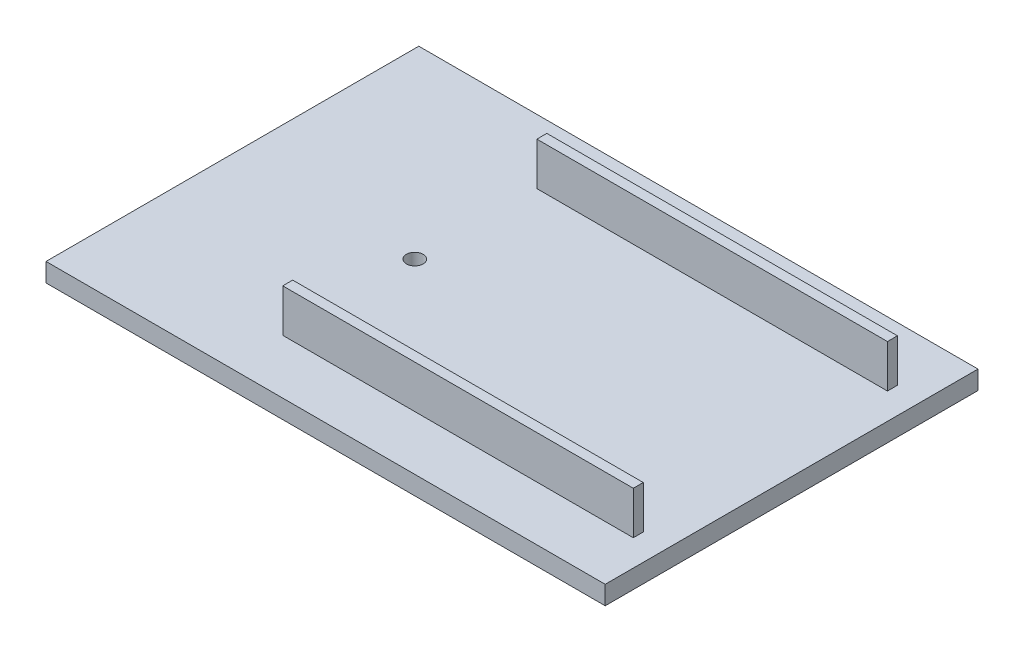
ISO-10303-21;
HEADER;
FILE_DESCRIPTION(('STEP AP214'),'2;1');
FILE_NAME('part.step','',(''),(''),'','','');
FILE_SCHEMA(('AUTOMOTIVE_DESIGN { 1 0 10303 214 1 1 1 1 }'));
ENDSEC;
DATA;
#1=APPLICATION_CONTEXT('core data for automotive mechanical design processes');
#2=APPLICATION_PROTOCOL_DEFINITION('international standard','automotive_design',2000,#1);
#3=PRODUCT_CONTEXT('',#1,'mechanical');
#4=PRODUCT('Part','Part','',(#3));
#5=PRODUCT_RELATED_PRODUCT_CATEGORY('part','',(#4));
#6=PRODUCT_DEFINITION_FORMATION('','',#4);
#7=PRODUCT_DEFINITION_CONTEXT('part definition',#1,'design');
#8=PRODUCT_DEFINITION('design','',#6,#7);
#9=PRODUCT_DEFINITION_SHAPE('','',#8);
#10=(LENGTH_UNIT() NAMED_UNIT(*) SI_UNIT(.MILLI.,.METRE.));
#11=(NAMED_UNIT(*) PLANE_ANGLE_UNIT() SI_UNIT($,.RADIAN.));
#12=(NAMED_UNIT(*) SI_UNIT($,.STERADIAN.) SOLID_ANGLE_UNIT());
#13=UNCERTAINTY_MEASURE_WITH_UNIT(LENGTH_MEASURE(1.E-05),#10,'distance_accuracy_value','');
#14=(GEOMETRIC_REPRESENTATION_CONTEXT(3) GLOBAL_UNCERTAINTY_ASSIGNED_CONTEXT((#13)) GLOBAL_UNIT_ASSIGNED_CONTEXT((#10,
#11,#12)) REPRESENTATION_CONTEXT('',''));
#15=CARTESIAN_POINT('',(0.,0.,0.));
#16=DIRECTION('',(0.,0.,1.));
#17=DIRECTION('',(1.,0.,0.));
#18=AXIS2_PLACEMENT_3D('',#15,#16,#17);
#19=CARTESIAN_POINT('',(0.,10.,0.));
#20=DIRECTION('',(0.,1.,0.));
#21=DIRECTION('',(0.,0.,1.));
#22=AXIS2_PLACEMENT_3D('',#19,#20,#21);
#23=PLANE('',#22);
#24=DIRECTION('',(-1.,0.,0.));
#25=VECTOR('',#24,1.);
#26=CARTESIAN_POINT('',(0.,10.,-65.5));
#27=LINE('',#26,#25);
#28=CARTESIAN_POINT('',(135.922227670832,10.,-65.5));
#29=VERTEX_POINT('',#28);
#30=CARTESIAN_POINT('',(-52.1493552323105,10.,-65.5));
#31=VERTEX_POINT('',#30);
#32=EDGE_CURVE('E212',#29,#31,#27,.T.);
#33=ORIENTED_EDGE('',*,*,#32,.T.);
#34=DIRECTION('',(0.,0.,-1.));
#35=VECTOR('',#34,1.);
#36=CARTESIAN_POINT('',(-52.1493552323105,10.,0.));
#37=LINE('',#36,#35);
#38=CARTESIAN_POINT('',(-52.1493552323105,10.,-70.8376694684691));
#39=VERTEX_POINT('',#38);
#40=EDGE_CURVE('E215',#31,#39,#37,.T.);
#41=ORIENTED_EDGE('',*,*,#40,.T.);
#42=DIRECTION('',(1.,0.,0.));
#43=VECTOR('',#42,1.);
#44=CARTESIAN_POINT('',(0.,10.,-70.8376694684691));
#45=LINE('',#44,#43);
#46=CARTESIAN_POINT('',(135.922227670832,10.,-70.8376694684691));
#47=VERTEX_POINT('',#46);
#48=EDGE_CURVE('E206',#39,#47,#45,.T.);
#49=ORIENTED_EDGE('',*,*,#48,.T.);
#50=DIRECTION('',(0.,0.,1.));
#51=VECTOR('',#50,1.);
#52=CARTESIAN_POINT('',(135.922227670832,10.,0.));
#53=LINE('',#52,#51);
#54=EDGE_CURVE('E209',#47,#29,#53,.T.);
#55=ORIENTED_EDGE('',*,*,#54,.T.);
#56=EDGE_LOOP('',(#33,#41,#49,#55));
#57=FACE_BOUND('',#56,.T.);
#58=CARTESIAN_POINT('',(-52.1493552323105,10.,0.));
#59=DIRECTION('',(0.,1.,0.));
#60=DIRECTION('',(0.,0.,1.));
#61=AXIS2_PLACEMENT_3D('',#58,#59,#60);
#62=CIRCLE('',#61,4.5);
#63=CARTESIAN_POINT('',(-52.1493552323105,10.,4.5));
#64=VERTEX_POINT('',#63);
#65=EDGE_CURVE('E170',#64,#64,#62,.T.);
#66=ORIENTED_EDGE('',*,*,#65,.F.);
#67=EDGE_LOOP('',(#66));
#68=FACE_BOUND('',#67,.T.);
#69=DIRECTION('',(0.,0.,-1.));
#70=VECTOR('',#69,1.);
#71=CARTESIAN_POINT('',(150.,10.,-100.));
#72=LINE('',#71,#70);
#73=CARTESIAN_POINT('',(150.,10.,100.));
#74=VERTEX_POINT('',#73);
#75=CARTESIAN_POINT('',(150.,10.,-100.));
#76=VERTEX_POINT('',#75);
#77=EDGE_CURVE('E177',#74,#76,#72,.T.);
#78=ORIENTED_EDGE('',*,*,#77,.T.);
#79=DIRECTION('',(-1.,0.,0.));
#80=VECTOR('',#79,1.);
#81=CARTESIAN_POINT('',(-150.,10.,-100.));
#82=LINE('',#81,#80);
#83=CARTESIAN_POINT('',(-150.,10.,-100.));
#84=VERTEX_POINT('',#83);
#85=EDGE_CURVE('E180',#76,#84,#82,.T.);
#86=ORIENTED_EDGE('',*,*,#85,.T.);
#87=DIRECTION('',(0.,0.,1.));
#88=VECTOR('',#87,1.);
#89=CARTESIAN_POINT('',(-150.,10.,-100.));
#90=LINE('',#89,#88);
#91=CARTESIAN_POINT('',(-150.,10.,100.));
#92=VERTEX_POINT('',#91);
#93=EDGE_CURVE('E183',#84,#92,#90,.T.);
#94=ORIENTED_EDGE('',*,*,#93,.T.);
#95=DIRECTION('',(1.,0.,0.));
#96=VECTOR('',#95,1.);
#97=CARTESIAN_POINT('',(-150.,10.,100.));
#98=LINE('',#97,#96);
#99=EDGE_CURVE('E185',#92,#74,#98,.T.);
#100=ORIENTED_EDGE('',*,*,#99,.T.);
#101=EDGE_LOOP('',(#78,#86,#94,#100));
#102=FACE_BOUND('',#101,.T.);
#103=DIRECTION('',(-1.,0.,0.));
#104=VECTOR('',#103,1.);
#105=CARTESIAN_POINT('',(0.,10.,70.8376694684691));
#106=LINE('',#105,#104);
#107=CARTESIAN_POINT('',(135.922227670832,10.,70.8376694684691));
#108=VERTEX_POINT('',#107);
#109=CARTESIAN_POINT('',(-52.1493552323105,10.,70.8376694684691));
#110=VERTEX_POINT('',#109);
#111=EDGE_CURVE('E43',#108,#110,#106,.T.);
#112=ORIENTED_EDGE('',*,*,#111,.T.);
#113=DIRECTION('',(0.,0.,-1.));
#114=VECTOR('',#113,1.);
#115=CARTESIAN_POINT('',(-52.1493552323105,10.,0.));
#116=LINE('',#115,#114);
#117=CARTESIAN_POINT('',(-52.1493552323105,10.,65.5));
#118=VERTEX_POINT('',#117);
#119=EDGE_CURVE('E11',#110,#118,#116,.T.);
#120=ORIENTED_EDGE('',*,*,#119,.T.);
#121=DIRECTION('',(1.,0.,0.));
#122=VECTOR('',#121,1.);
#123=CARTESIAN_POINT('',(0.,10.,65.5));
#124=LINE('',#123,#122);
#125=CARTESIAN_POINT('',(135.922227670832,10.,65.5));
#126=VERTEX_POINT('',#125);
#127=EDGE_CURVE('E218',#118,#126,#124,.T.);
#128=ORIENTED_EDGE('',*,*,#127,.T.);
#129=DIRECTION('',(0.,0.,1.));
#130=VECTOR('',#129,1.);
#131=CARTESIAN_POINT('',(135.922227670832,10.,0.));
#132=LINE('',#131,#130);
#133=EDGE_CURVE('E221',#126,#108,#132,.T.);
#134=ORIENTED_EDGE('',*,*,#133,.T.);
#135=EDGE_LOOP('',(#112,#120,#128,#134));
#136=FACE_BOUND('',#135,.T.);
#137=ADVANCED_FACE('F35',(#57,#68,#102,#136),#23,.T.);
#138=CARTESIAN_POINT('',(150.,10.,-100.));
#139=DIRECTION('',(-1.,0.,0.));
#140=DIRECTION('',(0.,0.,1.));
#141=AXIS2_PLACEMENT_3D('',#138,#139,#140);
#142=PLANE('',#141);
#143=DIRECTION('',(0.,0.,-1.));
#144=VECTOR('',#143,1.);
#145=CARTESIAN_POINT('',(150.,0.,-100.));
#146=LINE('',#145,#144);
#147=CARTESIAN_POINT('',(150.,0.,100.));
#148=VERTEX_POINT('',#147);
#149=CARTESIAN_POINT('',(150.,0.,-100.));
#150=VERTEX_POINT('',#149);
#151=EDGE_CURVE('E174',#148,#150,#146,.T.);
#152=ORIENTED_EDGE('',*,*,#151,.T.);
#153=DIRECTION('',(0.,-1.,0.));
#154=VECTOR('',#153,1.);
#155=CARTESIAN_POINT('',(150.,10.,-100.));
#156=LINE('',#155,#154);
#157=EDGE_CURVE('E203',#76,#150,#156,.T.);
#158=ORIENTED_EDGE('',*,*,#157,.F.);
#159=ORIENTED_EDGE('',*,*,#77,.F.);
#160=DIRECTION('',(0.,-1.,0.));
#161=VECTOR('',#160,1.);
#162=CARTESIAN_POINT('',(150.,10.,100.));
#163=LINE('',#162,#161);
#164=EDGE_CURVE('E187',#74,#148,#163,.T.);
#165=ORIENTED_EDGE('',*,*,#164,.T.);
#166=EDGE_LOOP('',(#152,#158,#159,#165));
#167=FACE_BOUND('',#166,.T.);
#168=ADVANCED_FACE('F37',(#167),#142,.F.);
#169=CARTESIAN_POINT('',(-150.,10.,-100.));
#170=DIRECTION('',(0.,0.,1.));
#171=DIRECTION('',(1.,0.,0.));
#172=AXIS2_PLACEMENT_3D('',#169,#170,#171);
#173=PLANE('',#172);
#174=DIRECTION('',(-1.,0.,0.));
#175=VECTOR('',#174,1.);
#176=CARTESIAN_POINT('',(-150.,0.,-100.));
#177=LINE('',#176,#175);
#178=CARTESIAN_POINT('',(-150.,0.,-100.));
#179=VERTEX_POINT('',#178);
#180=EDGE_CURVE('E190',#150,#179,#177,.T.);
#181=ORIENTED_EDGE('',*,*,#180,.T.);
#182=DIRECTION('',(0.,-1.,0.));
#183=VECTOR('',#182,1.);
#184=CARTESIAN_POINT('',(-150.,10.,-100.));
#185=LINE('',#184,#183);
#186=EDGE_CURVE('E200',#84,#179,#185,.T.);
#187=ORIENTED_EDGE('',*,*,#186,.F.);
#188=ORIENTED_EDGE('',*,*,#85,.F.);
#189=ORIENTED_EDGE('',*,*,#157,.T.);
#190=EDGE_LOOP('',(#181,#187,#188,#189));
#191=FACE_BOUND('',#190,.T.);
#192=ADVANCED_FACE('F247',(#191),#173,.F.);
#193=CARTESIAN_POINT('',(-150.,10.,-100.));
#194=DIRECTION('',(1.,0.,0.));
#195=DIRECTION('',(0.,0.,-1.));
#196=AXIS2_PLACEMENT_3D('',#193,#194,#195);
#197=PLANE('',#196);
#198=DIRECTION('',(0.,0.,1.));
#199=VECTOR('',#198,1.);
#200=CARTESIAN_POINT('',(-150.,0.,-100.));
#201=LINE('',#200,#199);
#202=CARTESIAN_POINT('',(-150.,0.,100.));
#203=VERTEX_POINT('',#202);
#204=EDGE_CURVE('E192',#179,#203,#201,.T.);
#205=ORIENTED_EDGE('',*,*,#204,.T.);
#206=DIRECTION('',(0.,-1.,0.));
#207=VECTOR('',#206,1.);
#208=CARTESIAN_POINT('',(-150.,10.,100.));
#209=LINE('',#208,#207);
#210=EDGE_CURVE('E197',#92,#203,#209,.T.);
#211=ORIENTED_EDGE('',*,*,#210,.F.);
#212=ORIENTED_EDGE('',*,*,#93,.F.);
#213=ORIENTED_EDGE('',*,*,#186,.T.);
#214=EDGE_LOOP('',(#205,#211,#212,#213));
#215=FACE_BOUND('',#214,.T.);
#216=ADVANCED_FACE('F261',(#215),#197,.F.);
#217=CARTESIAN_POINT('',(-150.,10.,100.));
#218=DIRECTION('',(0.,0.,-1.));
#219=DIRECTION('',(-1.,0.,0.));
#220=AXIS2_PLACEMENT_3D('',#217,#218,#219);
#221=PLANE('',#220);
#222=DIRECTION('',(1.,0.,0.));
#223=VECTOR('',#222,1.);
#224=CARTESIAN_POINT('',(-150.,0.,100.));
#225=LINE('',#224,#223);
#226=EDGE_CURVE('E181',#203,#148,#225,.T.);
#227=ORIENTED_EDGE('',*,*,#226,.T.);
#228=ORIENTED_EDGE('',*,*,#164,.F.);
#229=ORIENTED_EDGE('',*,*,#99,.F.);
#230=ORIENTED_EDGE('',*,*,#210,.T.);
#231=EDGE_LOOP('',(#227,#228,#229,#230));
#232=FACE_BOUND('',#231,.T.);
#233=ADVANCED_FACE('F257',(#232),#221,.F.);
#234=CARTESIAN_POINT('',(0.,0.,0.));
#235=DIRECTION('',(0.,1.,0.));
#236=DIRECTION('',(0.,0.,1.));
#237=AXIS2_PLACEMENT_3D('',#234,#235,#236);
#238=PLANE('',#237);
#239=ORIENTED_EDGE('',*,*,#151,.F.);
#240=ORIENTED_EDGE('',*,*,#226,.F.);
#241=ORIENTED_EDGE('',*,*,#204,.F.);
#242=ORIENTED_EDGE('',*,*,#180,.F.);
#243=EDGE_LOOP('',(#239,#240,#241,#242));
#244=FACE_BOUND('',#243,.T.);
#245=ADVANCED_FACE('F254',(#244),#238,.F.);
#246=CARTESIAN_POINT('',(-52.1493552323105,3.,0.));
#247=DIRECTION('',(0.,1.,0.));
#248=DIRECTION('',(0.,0.,1.));
#249=AXIS2_PLACEMENT_3D('',#246,#247,#248);
#250=CYLINDRICAL_SURFACE('',#249,4.5);
#251=CARTESIAN_POINT('',(-52.1493552323105,3.,0.));
#252=DIRECTION('',(0.,1.,0.));
#253=DIRECTION('',(0.,0.,1.));
#254=AXIS2_PLACEMENT_3D('',#251,#252,#253);
#255=CIRCLE('',#254,4.5);
#256=CARTESIAN_POINT('',(-52.1493552323105,3.,4.5));
#257=VERTEX_POINT('',#256);
#258=EDGE_CURVE('E171',#257,#257,#255,.T.);
#259=ORIENTED_EDGE('',*,*,#258,.F.);
#260=EDGE_LOOP('',(#259));
#261=FACE_BOUND('',#260,.T.);
#262=ORIENTED_EDGE('',*,*,#65,.T.);
#263=EDGE_LOOP('',(#262));
#264=FACE_BOUND('',#263,.T.);
#265=ADVANCED_FACE('F252',(#261,#264),#250,.F.);
#266=CARTESIAN_POINT('',(-52.1493552323105,3.,0.));
#267=DIRECTION('',(0.,1.,0.));
#268=DIRECTION('',(0.,0.,1.));
#269=AXIS2_PLACEMENT_3D('',#266,#267,#268);
#270=PLANE('',#269);
#271=ORIENTED_EDGE('',*,*,#258,.T.);
#272=EDGE_LOOP('',(#271));
#273=FACE_BOUND('',#272,.T.);
#274=ADVANCED_FACE('F300',(#273),#270,.T.);
#275=CARTESIAN_POINT('',(-52.1493552323105,33.,-65.5));
#276=DIRECTION('',(1.,0.,0.));
#277=DIRECTION('',(0.,0.,-1.));
#278=AXIS2_PLACEMENT_3D('',#275,#276,#277);
#279=PLANE('',#278);
#280=ORIENTED_EDGE('',*,*,#40,.F.);
#281=DIRECTION('',(0.,-1.,0.));
#282=VECTOR('',#281,1.);
#283=CARTESIAN_POINT('',(-52.1493552323105,33.,-65.5));
#284=LINE('',#283,#282);
#285=CARTESIAN_POINT('',(-52.1493552323105,33.,-65.5));
#286=VERTEX_POINT('',#285);
#287=EDGE_CURVE('E167',#286,#31,#284,.T.);
#288=ORIENTED_EDGE('',*,*,#287,.F.);
#289=DIRECTION('',(0.,0.,1.));
#290=VECTOR('',#289,1.);
#291=CARTESIAN_POINT('',(-52.1493552323105,33.,-65.5));
#292=LINE('',#291,#290);
#293=CARTESIAN_POINT('',(-52.1493552323105,33.,-70.8376694684691));
#294=VERTEX_POINT('',#293);
#295=EDGE_CURVE('E147',#294,#286,#292,.T.);
#296=ORIENTED_EDGE('',*,*,#295,.F.);
#297=DIRECTION('',(0.,-1.,0.));
#298=VECTOR('',#297,1.);
#299=CARTESIAN_POINT('',(-52.1493552323105,33.,-70.8376694684691));
#300=LINE('',#299,#298);
#301=EDGE_CURVE('E160',#294,#39,#300,.T.);
#302=ORIENTED_EDGE('',*,*,#301,.T.);
#303=EDGE_LOOP('',(#280,#288,#296,#302));
#304=FACE_BOUND('',#303,.T.);
#305=ADVANCED_FACE('F305',(#304),#279,.F.);
#306=CARTESIAN_POINT('',(-52.1493552323105,33.,-65.5));
#307=DIRECTION('',(0.,0.,-1.));
#308=DIRECTION('',(-1.,0.,0.));
#309=AXIS2_PLACEMENT_3D('',#306,#307,#308);
#310=PLANE('',#309);
#311=ORIENTED_EDGE('',*,*,#32,.F.);
#312=DIRECTION('',(0.,-1.,0.));
#313=VECTOR('',#312,1.);
#314=CARTESIAN_POINT('',(135.922227670832,33.,-65.5));
#315=LINE('',#314,#313);
#316=CARTESIAN_POINT('',(135.922227670832,33.,-65.5));
#317=VERTEX_POINT('',#316);
#318=EDGE_CURVE('E164',#317,#29,#315,.T.);
#319=ORIENTED_EDGE('',*,*,#318,.F.);
#320=DIRECTION('',(1.,0.,0.));
#321=VECTOR('',#320,1.);
#322=CARTESIAN_POINT('',(-52.1493552323105,33.,-65.5));
#323=LINE('',#322,#321);
#324=EDGE_CURVE('E150',#286,#317,#323,.T.);
#325=ORIENTED_EDGE('',*,*,#324,.F.);
#326=ORIENTED_EDGE('',*,*,#287,.T.);
#327=EDGE_LOOP('',(#311,#319,#325,#326));
#328=FACE_BOUND('',#327,.T.);
#329=ADVANCED_FACE('F317',(#328),#310,.F.);
#330=CARTESIAN_POINT('',(135.922227670832,33.,-65.5));
#331=DIRECTION('',(-1.,0.,0.));
#332=DIRECTION('',(0.,0.,1.));
#333=AXIS2_PLACEMENT_3D('',#330,#331,#332);
#334=PLANE('',#333);
#335=ORIENTED_EDGE('',*,*,#54,.F.);
#336=DIRECTION('',(0.,-1.,0.));
#337=VECTOR('',#336,1.);
#338=CARTESIAN_POINT('',(135.922227670832,33.,-70.8376694684691));
#339=LINE('',#338,#337);
#340=CARTESIAN_POINT('',(135.922227670832,33.,-70.8376694684691));
#341=VERTEX_POINT('',#340);
#342=EDGE_CURVE('E58',#341,#47,#339,.T.);
#343=ORIENTED_EDGE('',*,*,#342,.F.);
#344=DIRECTION('',(0.,0.,-1.));
#345=VECTOR('',#344,1.);
#346=CARTESIAN_POINT('',(135.922227670832,33.,-65.5));
#347=LINE('',#346,#345);
#348=EDGE_CURVE('E156',#317,#341,#347,.T.);
#349=ORIENTED_EDGE('',*,*,#348,.F.);
#350=ORIENTED_EDGE('',*,*,#318,.T.);
#351=EDGE_LOOP('',(#335,#343,#349,#350));
#352=FACE_BOUND('',#351,.T.);
#353=ADVANCED_FACE('F324',(#352),#334,.F.);
#354=CARTESIAN_POINT('',(-52.1493552323105,33.,-70.8376694684691));
#355=DIRECTION('',(0.,0.,1.));
#356=DIRECTION('',(1.,0.,0.));
#357=AXIS2_PLACEMENT_3D('',#354,#355,#356);
#358=PLANE('',#357);
#359=ORIENTED_EDGE('',*,*,#48,.F.);
#360=ORIENTED_EDGE('',*,*,#301,.F.);
#361=DIRECTION('',(-1.,0.,0.));
#362=VECTOR('',#361,1.);
#363=CARTESIAN_POINT('',(-52.1493552323105,33.,-70.8376694684691));
#364=LINE('',#363,#362);
#365=EDGE_CURVE('E158',#341,#294,#364,.T.);
#366=ORIENTED_EDGE('',*,*,#365,.F.);
#367=ORIENTED_EDGE('',*,*,#342,.T.);
#368=EDGE_LOOP('',(#359,#360,#366,#367));
#369=FACE_BOUND('',#368,.T.);
#370=ADVANCED_FACE('F332',(#369),#358,.F.);
#371=CARTESIAN_POINT('',(0.,33.,0.));
#372=DIRECTION('',(0.,-1.,0.));
#373=DIRECTION('',(0.,0.,-1.));
#374=AXIS2_PLACEMENT_3D('',#371,#372,#373);
#375=PLANE('',#374);
#376=ORIENTED_EDGE('',*,*,#295,.T.);
#377=ORIENTED_EDGE('',*,*,#324,.T.);
#378=ORIENTED_EDGE('',*,*,#348,.T.);
#379=ORIENTED_EDGE('',*,*,#365,.T.);
#380=EDGE_LOOP('',(#376,#377,#378,#379));
#381=FACE_BOUND('',#380,.T.);
#382=ADVANCED_FACE('F340',(#381),#375,.F.);
#383=CARTESIAN_POINT('',(-52.1493552323105,33.,65.5));
#384=DIRECTION('',(1.,0.,0.));
#385=DIRECTION('',(0.,0.,-1.));
#386=AXIS2_PLACEMENT_3D('',#383,#384,#385);
#387=PLANE('',#386);
#388=ORIENTED_EDGE('',*,*,#119,.F.);
#389=DIRECTION('',(0.,-1.,0.));
#390=VECTOR('',#389,1.);
#391=CARTESIAN_POINT('',(-52.1493552323105,33.,70.8376694684691));
#392=LINE('',#391,#390);
#393=CARTESIAN_POINT('',(-52.1493552323105,33.,70.8376694684691));
#394=VERTEX_POINT('',#393);
#395=EDGE_CURVE('E130',#394,#110,#392,.T.);
#396=ORIENTED_EDGE('',*,*,#395,.F.);
#397=DIRECTION('',(0.,0.,1.));
#398=VECTOR('',#397,1.);
#399=CARTESIAN_POINT('',(-52.1493552323105,33.,65.5));
#400=LINE('',#399,#398);
#401=CARTESIAN_POINT('',(-52.1493552323105,33.,65.5));
#402=VERTEX_POINT('',#401);
#403=EDGE_CURVE('E137',#402,#394,#400,.T.);
#404=ORIENTED_EDGE('',*,*,#403,.F.);
#405=DIRECTION('',(0.,-1.,0.));
#406=VECTOR('',#405,1.);
#407=CARTESIAN_POINT('',(-52.1493552323105,33.,65.5));
#408=LINE('',#407,#406);
#409=EDGE_CURVE('E227',#402,#118,#408,.T.);
#410=ORIENTED_EDGE('',*,*,#409,.T.);
#411=EDGE_LOOP('',(#388,#396,#404,#410));
#412=FACE_BOUND('',#411,.T.);
#413=ADVANCED_FACE('F146',(#412),#387,.F.);
#414=CARTESIAN_POINT('',(-52.1493552323105,33.,70.8376694684691));
#415=DIRECTION('',(0.,0.,-1.));
#416=DIRECTION('',(-1.,0.,0.));
#417=AXIS2_PLACEMENT_3D('',#414,#415,#416);
#418=PLANE('',#417);
#419=ORIENTED_EDGE('',*,*,#111,.F.);
#420=DIRECTION('',(0.,-1.,0.));
#421=VECTOR('',#420,1.);
#422=CARTESIAN_POINT('',(135.922227670832,33.,70.8376694684691));
#423=LINE('',#422,#421);
#424=CARTESIAN_POINT('',(135.922227670832,33.,70.8376694684691));
#425=VERTEX_POINT('',#424);
#426=EDGE_CURVE('E133',#425,#108,#423,.T.);
#427=ORIENTED_EDGE('',*,*,#426,.F.);
#428=DIRECTION('',(1.,0.,0.));
#429=VECTOR('',#428,1.);
#430=CARTESIAN_POINT('',(-52.1493552323105,33.,70.8376694684691));
#431=LINE('',#430,#429);
#432=EDGE_CURVE('E126',#394,#425,#431,.T.);
#433=ORIENTED_EDGE('',*,*,#432,.F.);
#434=ORIENTED_EDGE('',*,*,#395,.T.);
#435=EDGE_LOOP('',(#419,#427,#433,#434));
#436=FACE_BOUND('',#435,.T.);
#437=ADVANCED_FACE('F128',(#436),#418,.F.);
#438=CARTESIAN_POINT('',(135.922227670832,33.,65.5));
#439=DIRECTION('',(-1.,0.,0.));
#440=DIRECTION('',(0.,0.,1.));
#441=AXIS2_PLACEMENT_3D('',#438,#439,#440);
#442=PLANE('',#441);
#443=ORIENTED_EDGE('',*,*,#133,.F.);
#444=DIRECTION('',(0.,-1.,0.));
#445=VECTOR('',#444,1.);
#446=CARTESIAN_POINT('',(135.922227670832,33.,65.5));
#447=LINE('',#446,#445);
#448=CARTESIAN_POINT('',(135.922227670832,33.,65.5));
#449=VERTEX_POINT('',#448);
#450=EDGE_CURVE('E50',#449,#126,#447,.T.);
#451=ORIENTED_EDGE('',*,*,#450,.F.);
#452=DIRECTION('',(0.,0.,-1.));
#453=VECTOR('',#452,1.);
#454=CARTESIAN_POINT('',(135.922227670832,33.,65.5));
#455=LINE('',#454,#453);
#456=EDGE_CURVE('E136',#425,#449,#455,.T.);
#457=ORIENTED_EDGE('',*,*,#456,.F.);
#458=ORIENTED_EDGE('',*,*,#426,.T.);
#459=EDGE_LOOP('',(#443,#451,#457,#458));
#460=FACE_BOUND('',#459,.T.);
#461=ADVANCED_FACE('F225',(#460),#442,.F.);
#462=CARTESIAN_POINT('',(-52.1493552323105,33.,65.5));
#463=DIRECTION('',(0.,0.,1.));
#464=DIRECTION('',(1.,0.,0.));
#465=AXIS2_PLACEMENT_3D('',#462,#463,#464);
#466=PLANE('',#465);
#467=ORIENTED_EDGE('',*,*,#127,.F.);
#468=ORIENTED_EDGE('',*,*,#409,.F.);
#469=DIRECTION('',(-1.,0.,0.));
#470=VECTOR('',#469,1.);
#471=CARTESIAN_POINT('',(-52.1493552323105,33.,65.5));
#472=LINE('',#471,#470);
#473=EDGE_CURVE('E141',#449,#402,#472,.T.);
#474=ORIENTED_EDGE('',*,*,#473,.F.);
#475=ORIENTED_EDGE('',*,*,#450,.T.);
#476=EDGE_LOOP('',(#467,#468,#474,#475));
#477=FACE_BOUND('',#476,.T.);
#478=ADVANCED_FACE('F230',(#477),#466,.F.);
#479=CARTESIAN_POINT('',(0.,33.,0.));
#480=DIRECTION('',(0.,1.,0.));
#481=DIRECTION('',(0.,0.,1.));
#482=AXIS2_PLACEMENT_3D('',#479,#480,#481);
#483=PLANE('',#482);
#484=ORIENTED_EDGE('',*,*,#403,.T.);
#485=ORIENTED_EDGE('',*,*,#432,.T.);
#486=ORIENTED_EDGE('',*,*,#456,.T.);
#487=ORIENTED_EDGE('',*,*,#473,.T.);
#488=EDGE_LOOP('',(#484,#485,#486,#487));
#489=FACE_BOUND('',#488,.T.);
#490=ADVANCED_FACE('F140',(#489),#483,.T.);
#491=CLOSED_SHELL('',(#137,#168,#192,#216,#233,#245,#265,#274,#305,#329,#353,#370,#382,#413,
#437,#461,#478,#490));
#492=MANIFOLD_SOLID_BREP('B2',#491);
#493=ADVANCED_BREP_SHAPE_REPRESENTATION('',(#18,#492),#14);
#494=SHAPE_DEFINITION_REPRESENTATION(#9,#493);
ENDSEC;
END-ISO-10303-21;
